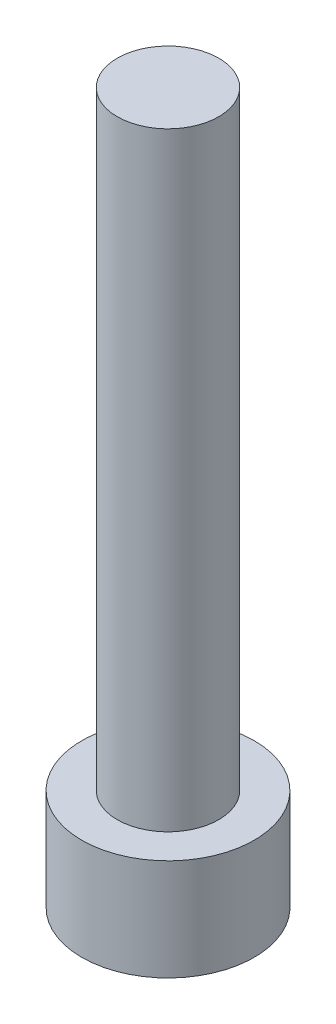
ISO-10303-21;
HEADER;
FILE_DESCRIPTION(('STEP AP214'),'2;1');
FILE_NAME('part.step','',(''),(''),'','','');
FILE_SCHEMA(('AUTOMOTIVE_DESIGN { 1 0 10303 214 1 1 1 1 }'));
ENDSEC;
DATA;
#1=APPLICATION_CONTEXT('core data for automotive mechanical design processes');
#2=APPLICATION_PROTOCOL_DEFINITION('international standard','automotive_design',2000,#1);
#3=PRODUCT_CONTEXT('',#1,'mechanical');
#4=PRODUCT('Part','Part','',(#3));
#5=PRODUCT_RELATED_PRODUCT_CATEGORY('part','',(#4));
#6=PRODUCT_DEFINITION_FORMATION('','',#4);
#7=PRODUCT_DEFINITION_CONTEXT('part definition',#1,'design');
#8=PRODUCT_DEFINITION('design','',#6,#7);
#9=PRODUCT_DEFINITION_SHAPE('','',#8);
#10=(LENGTH_UNIT() NAMED_UNIT(*) SI_UNIT(.MILLI.,.METRE.));
#11=(NAMED_UNIT(*) PLANE_ANGLE_UNIT() SI_UNIT($,.RADIAN.));
#12=(NAMED_UNIT(*) SI_UNIT($,.STERADIAN.) SOLID_ANGLE_UNIT());
#13=UNCERTAINTY_MEASURE_WITH_UNIT(LENGTH_MEASURE(1.E-05),#10,'distance_accuracy_value','');
#14=(GEOMETRIC_REPRESENTATION_CONTEXT(3) GLOBAL_UNCERTAINTY_ASSIGNED_CONTEXT((#13)) GLOBAL_UNIT_ASSIGNED_CONTEXT((#10,
#11,#12)) REPRESENTATION_CONTEXT('',''));
#15=CARTESIAN_POINT('',(0.,0.,0.));
#16=DIRECTION('',(0.,0.,1.));
#17=DIRECTION('',(1.,0.,0.));
#18=AXIS2_PLACEMENT_3D('',#15,#16,#17);
#19=CARTESIAN_POINT('',(0.,0.,0.));
#20=DIRECTION('',(0.,1.,0.));
#21=DIRECTION('',(0.,0.,1.));
#22=AXIS2_PLACEMENT_3D('',#19,#20,#21);
#23=PLANE('',#22);
#24=CARTESIAN_POINT('',(0.,0.,0.));
#25=DIRECTION('',(0.,1.,0.));
#26=DIRECTION('',(0.,0.,1.));
#27=AXIS2_PLACEMENT_3D('',#24,#25,#26);
#28=CIRCLE('',#27,4.25);
#29=CARTESIAN_POINT('',(0.,0.,4.25));
#30=VERTEX_POINT('',#29);
#31=EDGE_CURVE('E39',#30,#30,#28,.T.);
#32=ORIENTED_EDGE('',*,*,#31,.F.);
#33=EDGE_LOOP('',(#32));
#34=FACE_BOUND('',#33,.T.);
#35=DIRECTION('',(0.5,0.,-0.866025403784439));
#36=VECTOR('',#35,1.);
#37=CARTESIAN_POINT('',(1.15470053837925,0.,2.));
#38=LINE('',#37,#36);
#39=CARTESIAN_POINT('',(1.15470053837925,0.,2.));
#40=VERTEX_POINT('',#39);
#41=CARTESIAN_POINT('',(2.3094010767585,0.,0.));
#42=VERTEX_POINT('',#41);
#43=EDGE_CURVE('E52',#40,#42,#38,.T.);
#44=ORIENTED_EDGE('',*,*,#43,.T.);
#45=DIRECTION('',(-0.5,0.,-0.866025403784438));
#46=VECTOR('',#45,1.);
#47=CARTESIAN_POINT('',(2.3094010767585,0.,0.));
#48=LINE('',#47,#46);
#49=CARTESIAN_POINT('',(1.15470053837925,0.,-2.));
#50=VERTEX_POINT('',#49);
#51=EDGE_CURVE('E123',#42,#50,#48,.T.);
#52=ORIENTED_EDGE('',*,*,#51,.T.);
#53=DIRECTION('',(-1.,0.,0.));
#54=VECTOR('',#53,1.);
#55=CARTESIAN_POINT('',(1.15470053837925,0.,-2.));
#56=LINE('',#55,#54);
#57=CARTESIAN_POINT('',(-1.15470053837925,0.,-2.));
#58=VERTEX_POINT('',#57);
#59=EDGE_CURVE('E126',#50,#58,#56,.T.);
#60=ORIENTED_EDGE('',*,*,#59,.T.);
#61=DIRECTION('',(-0.5,0.,0.866025403784438));
#62=VECTOR('',#61,1.);
#63=CARTESIAN_POINT('',(-1.15470053837925,0.,-2.));
#64=LINE('',#63,#62);
#65=CARTESIAN_POINT('',(-2.3094010767585,0.,0.));
#66=VERTEX_POINT('',#65);
#67=EDGE_CURVE('E129',#58,#66,#64,.T.);
#68=ORIENTED_EDGE('',*,*,#67,.T.);
#69=DIRECTION('',(0.5,0.,0.866025403784438));
#70=VECTOR('',#69,1.);
#71=CARTESIAN_POINT('',(-2.3094010767585,0.,0.));
#72=LINE('',#71,#70);
#73=CARTESIAN_POINT('',(-1.15470053837925,0.,2.));
#74=VERTEX_POINT('',#73);
#75=EDGE_CURVE('E113',#66,#74,#72,.T.);
#76=ORIENTED_EDGE('',*,*,#75,.T.);
#77=DIRECTION('',(1.,0.,0.));
#78=VECTOR('',#77,1.);
#79=CARTESIAN_POINT('',(-1.15470053837925,0.,2.));
#80=LINE('',#79,#78);
#81=EDGE_CURVE('E132',#74,#40,#80,.T.);
#82=ORIENTED_EDGE('',*,*,#81,.T.);
#83=EDGE_LOOP('',(#44,#52,#60,#68,#76,#82));
#84=FACE_BOUND('',#83,.T.);
#85=ADVANCED_FACE('F35',(#34,#84),#23,.F.);
#86=CARTESIAN_POINT('',(0.,5.,0.));
#87=DIRECTION('',(0.,-1.,0.));
#88=DIRECTION('',(0.,0.,-1.));
#89=AXIS2_PLACEMENT_3D('',#86,#87,#88);
#90=CYLINDRICAL_SURFACE('',#89,4.25);
#91=CARTESIAN_POINT('',(0.,5.,0.));
#92=DIRECTION('',(0.,1.,0.));
#93=DIRECTION('',(0.,0.,1.));
#94=AXIS2_PLACEMENT_3D('',#91,#92,#93);
#95=CIRCLE('',#94,4.25);
#96=CARTESIAN_POINT('',(0.,5.,4.25));
#97=VERTEX_POINT('',#96);
#98=EDGE_CURVE('E44',#97,#97,#95,.T.);
#99=ORIENTED_EDGE('',*,*,#98,.F.);
#100=EDGE_LOOP('',(#99));
#101=FACE_BOUND('',#100,.T.);
#102=ORIENTED_EDGE('',*,*,#31,.T.);
#103=EDGE_LOOP('',(#102));
#104=FACE_BOUND('',#103,.T.);
#105=ADVANCED_FACE('F37',(#101,#104),#90,.T.);
#106=CARTESIAN_POINT('',(0.,5.,0.));
#107=DIRECTION('',(0.,1.,0.));
#108=DIRECTION('',(0.,0.,1.));
#109=AXIS2_PLACEMENT_3D('',#106,#107,#108);
#110=PLANE('',#109);
#111=CARTESIAN_POINT('',(0.,5.,0.));
#112=DIRECTION('',(0.,1.,0.));
#113=DIRECTION('',(0.,0.,1.));
#114=AXIS2_PLACEMENT_3D('',#111,#112,#113);
#115=CIRCLE('',#114,2.5);
#116=CARTESIAN_POINT('',(0.,5.,2.5));
#117=VERTEX_POINT('',#116);
#118=EDGE_CURVE('E11',#117,#117,#115,.T.);
#119=ORIENTED_EDGE('',*,*,#118,.F.);
#120=EDGE_LOOP('',(#119));
#121=FACE_BOUND('',#120,.T.);
#122=ORIENTED_EDGE('',*,*,#98,.T.);
#123=EDGE_LOOP('',(#122));
#124=FACE_BOUND('',#123,.T.);
#125=ADVANCED_FACE('F182',(#121,#124),#110,.T.);
#126=CARTESIAN_POINT('',(0.,35.,0.));
#127=DIRECTION('',(0.,-1.,0.));
#128=DIRECTION('',(0.,0.,-1.));
#129=AXIS2_PLACEMENT_3D('',#126,#127,#128);
#130=CYLINDRICAL_SURFACE('',#129,2.5);
#131=CARTESIAN_POINT('',(0.,35.,0.));
#132=DIRECTION('',(0.,1.,0.));
#133=DIRECTION('',(0.,0.,1.));
#134=AXIS2_PLACEMENT_3D('',#131,#132,#133);
#135=CIRCLE('',#134,2.5);
#136=CARTESIAN_POINT('',(0.,35.,2.5));
#137=VERTEX_POINT('',#136);
#138=EDGE_CURVE('E143',#137,#137,#135,.T.);
#139=ORIENTED_EDGE('',*,*,#138,.F.);
#140=EDGE_LOOP('',(#139));
#141=FACE_BOUND('',#140,.T.);
#142=ORIENTED_EDGE('',*,*,#118,.T.);
#143=EDGE_LOOP('',(#142));
#144=FACE_BOUND('',#143,.T.);
#145=ADVANCED_FACE('F178',(#141,#144),#130,.T.);
#146=CARTESIAN_POINT('',(0.,35.,0.));
#147=DIRECTION('',(0.,1.,0.));
#148=DIRECTION('',(0.,0.,1.));
#149=AXIS2_PLACEMENT_3D('',#146,#147,#148);
#150=PLANE('',#149);
#151=ORIENTED_EDGE('',*,*,#138,.T.);
#152=EDGE_LOOP('',(#151));
#153=FACE_BOUND('',#152,.T.);
#154=ADVANCED_FACE('F172',(#153),#150,.T.);
#155=CARTESIAN_POINT('',(1.15470053837925,2.5,2.));
#156=DIRECTION('',(-0.866025403784439,0.,-0.5));
#157=DIRECTION('',(-0.5,0.,0.866025403784439));
#158=AXIS2_PLACEMENT_3D('',#155,#156,#157);
#159=PLANE('',#158);
#160=ORIENTED_EDGE('',*,*,#43,.F.);
#161=DIRECTION('',(0.,-1.,0.));
#162=VECTOR('',#161,1.);
#163=CARTESIAN_POINT('',(1.15470053837925,2.5,2.));
#164=LINE('',#163,#162);
#165=CARTESIAN_POINT('',(1.15470053837925,2.5,2.));
#166=VERTEX_POINT('',#165);
#167=EDGE_CURVE('E118',#166,#40,#164,.T.);
#168=ORIENTED_EDGE('',*,*,#167,.F.);
#169=DIRECTION('',(0.5,0.,-0.866025403784439));
#170=VECTOR('',#169,1.);
#171=CARTESIAN_POINT('',(1.15470053837925,2.5,2.));
#172=LINE('',#171,#170);
#173=CARTESIAN_POINT('',(2.3094010767585,2.5,0.));
#174=VERTEX_POINT('',#173);
#175=EDGE_CURVE('E135',#166,#174,#172,.T.);
#176=ORIENTED_EDGE('',*,*,#175,.T.);
#177=DIRECTION('',(0.,-1.,0.));
#178=VECTOR('',#177,1.);
#179=CARTESIAN_POINT('',(2.3094010767585,2.5,0.));
#180=LINE('',#179,#178);
#181=EDGE_CURVE('E141',#174,#42,#180,.T.);
#182=ORIENTED_EDGE('',*,*,#181,.T.);
#183=EDGE_LOOP('',(#160,#168,#176,#182));
#184=FACE_BOUND('',#183,.T.);
#185=ADVANCED_FACE('F155',(#184),#159,.T.);
#186=CARTESIAN_POINT('',(2.3094010767585,2.5,0.));
#187=DIRECTION('',(-0.866025403784438,0.,0.5));
#188=DIRECTION('',(0.500000000000001,0.,0.866025403784438));
#189=AXIS2_PLACEMENT_3D('',#186,#187,#188);
#190=PLANE('',#189);
#191=ORIENTED_EDGE('',*,*,#51,.F.);
#192=ORIENTED_EDGE('',*,*,#181,.F.);
#193=DIRECTION('',(-0.5,0.,-0.866025403784438));
#194=VECTOR('',#193,1.);
#195=CARTESIAN_POINT('',(2.3094010767585,2.5,0.));
#196=LINE('',#195,#194);
#197=CARTESIAN_POINT('',(1.15470053837925,2.5,-2.));
#198=VERTEX_POINT('',#197);
#199=EDGE_CURVE('E91',#174,#198,#196,.T.);
#200=ORIENTED_EDGE('',*,*,#199,.T.);
#201=DIRECTION('',(0.,-1.,0.));
#202=VECTOR('',#201,1.);
#203=CARTESIAN_POINT('',(1.15470053837925,2.5,-2.));
#204=LINE('',#203,#202);
#205=EDGE_CURVE('E139',#198,#50,#204,.T.);
#206=ORIENTED_EDGE('',*,*,#205,.T.);
#207=EDGE_LOOP('',(#191,#192,#200,#206));
#208=FACE_BOUND('',#207,.T.);
#209=ADVANCED_FACE('F164',(#208),#190,.T.);
#210=CARTESIAN_POINT('',(1.15470053837925,2.5,-2.));
#211=DIRECTION('',(0.,0.,1.));
#212=DIRECTION('',(1.,0.,0.));
#213=AXIS2_PLACEMENT_3D('',#210,#211,#212);
#214=PLANE('',#213);
#215=ORIENTED_EDGE('',*,*,#59,.F.);
#216=ORIENTED_EDGE('',*,*,#205,.F.);
#217=DIRECTION('',(-1.,0.,0.));
#218=VECTOR('',#217,1.);
#219=CARTESIAN_POINT('',(1.15470053837925,2.5,-2.));
#220=LINE('',#219,#218);
#221=CARTESIAN_POINT('',(-1.15470053837925,2.5,-2.));
#222=VERTEX_POINT('',#221);
#223=EDGE_CURVE('E109',#198,#222,#220,.T.);
#224=ORIENTED_EDGE('',*,*,#223,.T.);
#225=DIRECTION('',(0.,-1.,0.));
#226=VECTOR('',#225,1.);
#227=CARTESIAN_POINT('',(-1.15470053837925,2.5,-2.));
#228=LINE('',#227,#226);
#229=EDGE_CURVE('E106',#222,#58,#228,.T.);
#230=ORIENTED_EDGE('',*,*,#229,.T.);
#231=EDGE_LOOP('',(#215,#216,#224,#230));
#232=FACE_BOUND('',#231,.T.);
#233=ADVANCED_FACE('F162',(#232),#214,.T.);
#234=CARTESIAN_POINT('',(-1.15470053837925,2.5,-2.));
#235=DIRECTION('',(0.866025403784439,0.,0.5));
#236=DIRECTION('',(0.5,0.,-0.866025403784439));
#237=AXIS2_PLACEMENT_3D('',#234,#235,#236);
#238=PLANE('',#237);
#239=ORIENTED_EDGE('',*,*,#67,.F.);
#240=ORIENTED_EDGE('',*,*,#229,.F.);
#241=DIRECTION('',(-0.5,0.,0.866025403784438));
#242=VECTOR('',#241,1.);
#243=CARTESIAN_POINT('',(-1.15470053837925,2.5,-2.));
#244=LINE('',#243,#242);
#245=CARTESIAN_POINT('',(-2.3094010767585,2.5,0.));
#246=VERTEX_POINT('',#245);
#247=EDGE_CURVE('E101',#222,#246,#244,.T.);
#248=ORIENTED_EDGE('',*,*,#247,.T.);
#249=DIRECTION('',(0.,-1.,0.));
#250=VECTOR('',#249,1.);
#251=CARTESIAN_POINT('',(-2.3094010767585,2.5,0.));
#252=LINE('',#251,#250);
#253=EDGE_CURVE('E105',#246,#66,#252,.T.);
#254=ORIENTED_EDGE('',*,*,#253,.T.);
#255=EDGE_LOOP('',(#239,#240,#248,#254));
#256=FACE_BOUND('',#255,.T.);
#257=ADVANCED_FACE('F104',(#256),#238,.T.);
#258=CARTESIAN_POINT('',(-2.3094010767585,2.5,0.));
#259=DIRECTION('',(0.866025403784438,0.,-0.5));
#260=DIRECTION('',(-0.5,0.,-0.866025403784439));
#261=AXIS2_PLACEMENT_3D('',#258,#259,#260);
#262=PLANE('',#261);
#263=ORIENTED_EDGE('',*,*,#75,.F.);
#264=ORIENTED_EDGE('',*,*,#253,.F.);
#265=DIRECTION('',(0.5,0.,0.866025403784438));
#266=VECTOR('',#265,1.);
#267=CARTESIAN_POINT('',(-2.3094010767585,2.5,0.));
#268=LINE('',#267,#266);
#269=CARTESIAN_POINT('',(-1.15470053837925,2.5,2.));
#270=VERTEX_POINT('',#269);
#271=EDGE_CURVE('E108',#246,#270,#268,.T.);
#272=ORIENTED_EDGE('',*,*,#271,.T.);
#273=DIRECTION('',(0.,-1.,0.));
#274=VECTOR('',#273,1.);
#275=CARTESIAN_POINT('',(-1.15470053837925,2.5,2.));
#276=LINE('',#275,#274);
#277=EDGE_CURVE('E82',#270,#74,#276,.T.);
#278=ORIENTED_EDGE('',*,*,#277,.T.);
#279=EDGE_LOOP('',(#263,#264,#272,#278));
#280=FACE_BOUND('',#279,.T.);
#281=ADVANCED_FACE('F111',(#280),#262,.T.);
#282=CARTESIAN_POINT('',(-1.15470053837925,2.5,2.));
#283=DIRECTION('',(0.,0.,-1.));
#284=DIRECTION('',(-1.,0.,0.));
#285=AXIS2_PLACEMENT_3D('',#282,#283,#284);
#286=PLANE('',#285);
#287=ORIENTED_EDGE('',*,*,#81,.F.);
#288=ORIENTED_EDGE('',*,*,#277,.F.);
#289=DIRECTION('',(1.,0.,0.));
#290=VECTOR('',#289,1.);
#291=CARTESIAN_POINT('',(-1.15470053837925,2.5,2.));
#292=LINE('',#291,#290);
#293=EDGE_CURVE('E60',#270,#166,#292,.T.);
#294=ORIENTED_EDGE('',*,*,#293,.T.);
#295=ORIENTED_EDGE('',*,*,#167,.T.);
#296=EDGE_LOOP('',(#287,#288,#294,#295));
#297=FACE_BOUND('',#296,.T.);
#298=ADVANCED_FACE('F154',(#297),#286,.T.);
#299=CARTESIAN_POINT('',(0.,2.5,0.));
#300=DIRECTION('',(0.,1.,0.));
#301=DIRECTION('',(0.,0.,1.));
#302=AXIS2_PLACEMENT_3D('',#299,#300,#301);
#303=PLANE('',#302);
#304=ORIENTED_EDGE('',*,*,#175,.F.);
#305=ORIENTED_EDGE('',*,*,#293,.F.);
#306=ORIENTED_EDGE('',*,*,#271,.F.);
#307=ORIENTED_EDGE('',*,*,#247,.F.);
#308=ORIENTED_EDGE('',*,*,#223,.F.);
#309=ORIENTED_EDGE('',*,*,#199,.F.);
#310=EDGE_LOOP('',(#304,#305,#306,#307,#308,#309));
#311=FACE_BOUND('',#310,.T.);
#312=ADVANCED_FACE('F116',(#311),#303,.F.);
#313=CLOSED_SHELL('',(#85,#105,#125,#145,#154,#185,#209,#233,#257,#281,#298,#312));
#314=MANIFOLD_SOLID_BREP('B2',#313);
#315=ADVANCED_BREP_SHAPE_REPRESENTATION('',(#18,#314),#14);
#316=SHAPE_DEFINITION_REPRESENTATION(#9,#315);
ENDSEC;
END-ISO-10303-21;
